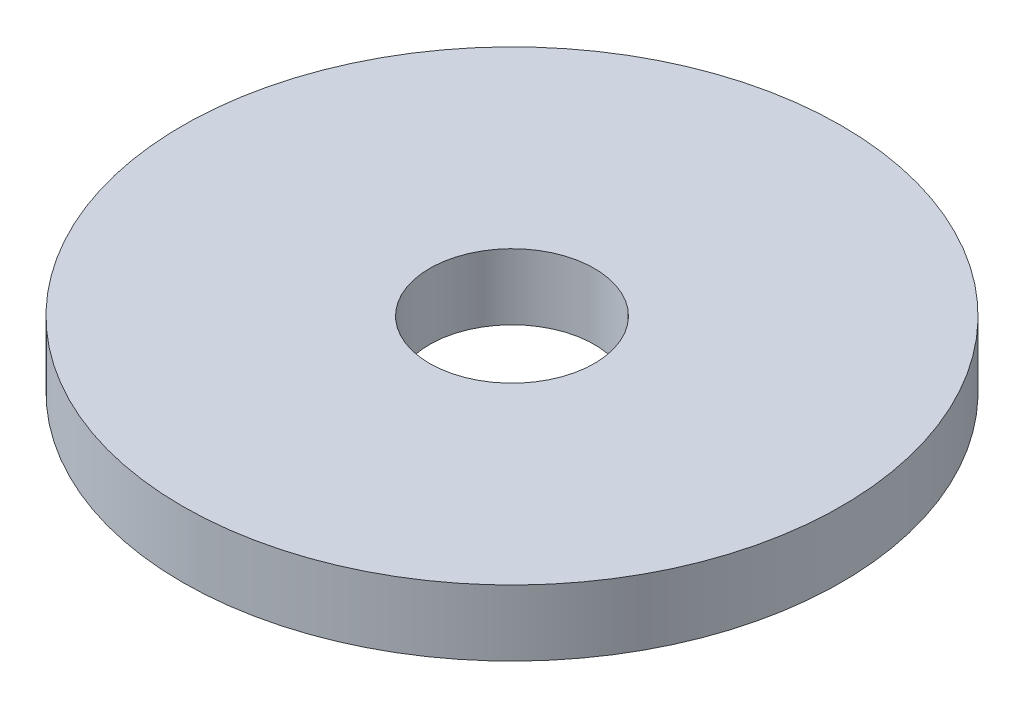
ISO-10303-21;
HEADER;
FILE_DESCRIPTION(('STEP AP214'),'2;1');
FILE_NAME('part.step','',(''),(''),'','','');
FILE_SCHEMA(('AUTOMOTIVE_DESIGN { 1 0 10303 214 1 1 1 1 }'));
ENDSEC;
DATA;
#1=APPLICATION_CONTEXT('core data for automotive mechanical design processes');
#2=APPLICATION_PROTOCOL_DEFINITION('international standard','automotive_design',2000,#1);
#3=PRODUCT_CONTEXT('',#1,'mechanical');
#4=PRODUCT('Part','Part','',(#3));
#5=PRODUCT_RELATED_PRODUCT_CATEGORY('part','',(#4));
#6=PRODUCT_DEFINITION_FORMATION('','',#4);
#7=PRODUCT_DEFINITION_CONTEXT('part definition',#1,'design');
#8=PRODUCT_DEFINITION('design','',#6,#7);
#9=PRODUCT_DEFINITION_SHAPE('','',#8);
#10=(LENGTH_UNIT() NAMED_UNIT(*) SI_UNIT(.MILLI.,.METRE.));
#11=(NAMED_UNIT(*) PLANE_ANGLE_UNIT() SI_UNIT($,.RADIAN.));
#12=(NAMED_UNIT(*) SI_UNIT($,.STERADIAN.) SOLID_ANGLE_UNIT());
#13=UNCERTAINTY_MEASURE_WITH_UNIT(LENGTH_MEASURE(1.E-05),#10,'distance_accuracy_value','');
#14=(GEOMETRIC_REPRESENTATION_CONTEXT(3) GLOBAL_UNCERTAINTY_ASSIGNED_CONTEXT((#13)) GLOBAL_UNIT_ASSIGNED_CONTEXT((#10,
#11,#12)) REPRESENTATION_CONTEXT('',''));
#15=CARTESIAN_POINT('',(0.,0.,0.));
#16=DIRECTION('',(0.,0.,1.));
#17=DIRECTION('',(1.,0.,0.));
#18=AXIS2_PLACEMENT_3D('',#15,#16,#17);
#19=CARTESIAN_POINT('',(0.,2.,0.));
#20=DIRECTION('',(0.,1.,0.));
#21=DIRECTION('',(0.,0.,1.));
#22=AXIS2_PLACEMENT_3D('',#19,#20,#21);
#23=PLANE('',#22);
#24=CARTESIAN_POINT('',(0.,2.,0.));
#25=DIRECTION('',(0.,1.,0.));
#26=DIRECTION('',(0.,0.,1.));
#27=AXIS2_PLACEMENT_3D('',#24,#25,#26);
#28=CIRCLE('',#27,10.);
#29=CARTESIAN_POINT('',(0.,2.,10.));
#30=VERTEX_POINT('',#29);
#31=EDGE_CURVE('E10',#30,#30,#28,.T.);
#32=ORIENTED_EDGE('',*,*,#31,.T.);
#33=EDGE_LOOP('',(#32));
#34=FACE_BOUND('',#33,.T.);
#35=CARTESIAN_POINT('',(0.,2.,0.));
#36=DIRECTION('',(0.,1.,0.));
#37=DIRECTION('',(0.,0.,1.));
#38=AXIS2_PLACEMENT_3D('',#35,#36,#37);
#39=CIRCLE('',#38,2.5);
#40=CARTESIAN_POINT('',(0.,2.,2.5));
#41=VERTEX_POINT('',#40);
#42=EDGE_CURVE('E52',#41,#41,#39,.T.);
#43=ORIENTED_EDGE('',*,*,#42,.F.);
#44=EDGE_LOOP('',(#43));
#45=FACE_BOUND('',#44,.T.);
#46=ADVANCED_FACE('F38',(#34,#45),#23,.T.);
#47=CARTESIAN_POINT('',(0.,0.,0.));
#48=DIRECTION('',(0.,1.,0.));
#49=DIRECTION('',(0.,0.,1.));
#50=AXIS2_PLACEMENT_3D('',#47,#48,#49);
#51=PLANE('',#50);
#52=CARTESIAN_POINT('',(0.,0.,0.));
#53=DIRECTION('',(0.,1.,0.));
#54=DIRECTION('',(0.,0.,1.));
#55=AXIS2_PLACEMENT_3D('',#52,#53,#54);
#56=CIRCLE('',#55,10.);
#57=CARTESIAN_POINT('',(0.,0.,10.));
#58=VERTEX_POINT('',#57);
#59=EDGE_CURVE('E42',#58,#58,#56,.T.);
#60=ORIENTED_EDGE('',*,*,#59,.F.);
#61=EDGE_LOOP('',(#60));
#62=FACE_BOUND('',#61,.T.);
#63=CARTESIAN_POINT('',(0.,0.,0.));
#64=DIRECTION('',(0.,1.,0.));
#65=DIRECTION('',(0.,0.,1.));
#66=AXIS2_PLACEMENT_3D('',#63,#64,#65);
#67=CIRCLE('',#66,2.5);
#68=CARTESIAN_POINT('',(0.,0.,2.5));
#69=VERTEX_POINT('',#68);
#70=EDGE_CURVE('E54',#69,#69,#67,.T.);
#71=ORIENTED_EDGE('',*,*,#70,.T.);
#72=EDGE_LOOP('',(#71));
#73=FACE_BOUND('',#72,.T.);
#74=ADVANCED_FACE('F67',(#62,#73),#51,.F.);
#75=CARTESIAN_POINT('',(0.,2.,0.));
#76=DIRECTION('',(0.,-1.,0.));
#77=DIRECTION('',(0.,0.,-1.));
#78=AXIS2_PLACEMENT_3D('',#75,#76,#77);
#79=CYLINDRICAL_SURFACE('',#78,10.);
#80=ORIENTED_EDGE('',*,*,#31,.F.);
#81=EDGE_LOOP('',(#80));
#82=FACE_BOUND('',#81,.T.);
#83=ORIENTED_EDGE('',*,*,#59,.T.);
#84=EDGE_LOOP('',(#83));
#85=FACE_BOUND('',#84,.T.);
#86=ADVANCED_FACE('F40',(#82,#85),#79,.T.);
#87=CARTESIAN_POINT('',(0.,2.,0.));
#88=DIRECTION('',(0.,-1.,0.));
#89=DIRECTION('',(0.,0.,-1.));
#90=AXIS2_PLACEMENT_3D('',#87,#88,#89);
#91=CYLINDRICAL_SURFACE('',#90,2.5);
#92=ORIENTED_EDGE('',*,*,#42,.T.);
#93=EDGE_LOOP('',(#92));
#94=FACE_BOUND('',#93,.T.);
#95=ORIENTED_EDGE('',*,*,#70,.F.);
#96=EDGE_LOOP('',(#95));
#97=FACE_BOUND('',#96,.T.);
#98=ADVANCED_FACE('F63',(#94,#97),#91,.F.);
#99=CLOSED_SHELL('',(#46,#74,#86,#98));
#100=MANIFOLD_SOLID_BREP('B2',#99);
#101=ADVANCED_BREP_SHAPE_REPRESENTATION('',(#18,#100),#14);
#102=SHAPE_DEFINITION_REPRESENTATION(#9,#101);
ENDSEC;
END-ISO-10303-21;
